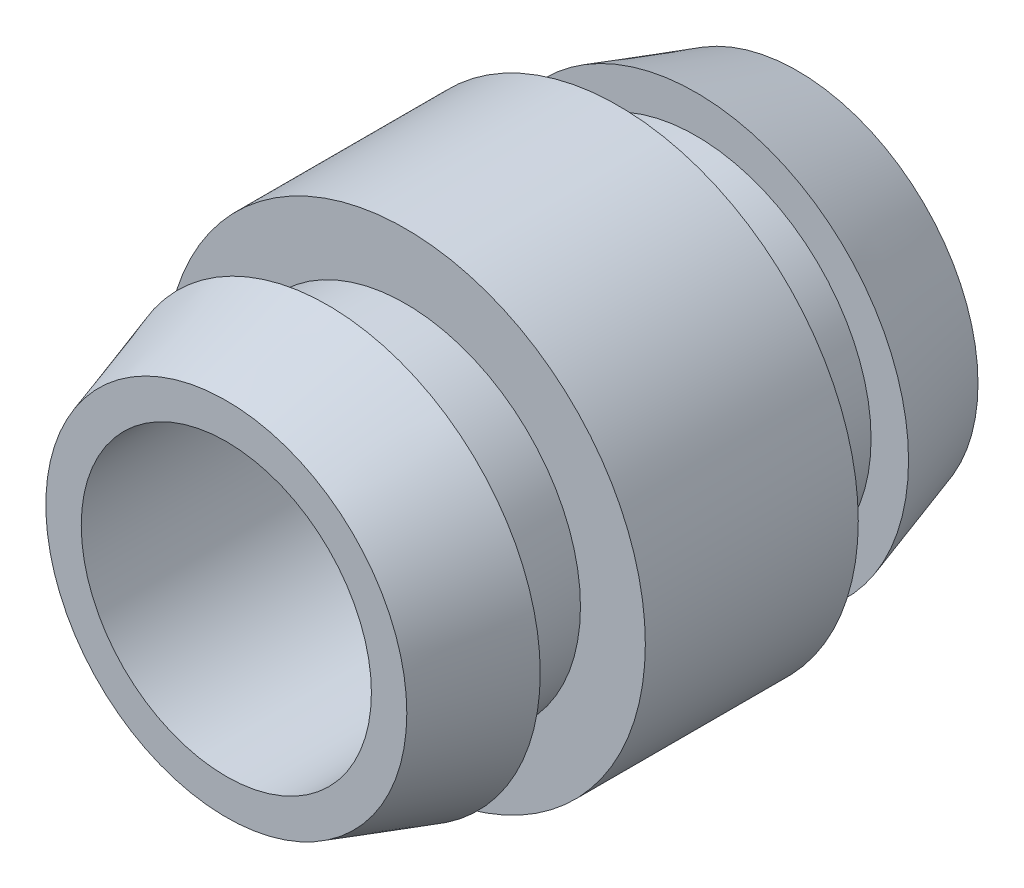
ISO-10303-21;
HEADER;
FILE_DESCRIPTION(('STEP AP214'),'2;1');
FILE_NAME('part.step','',(''),(''),'','','');
FILE_SCHEMA(('AUTOMOTIVE_DESIGN { 1 0 10303 214 1 1 1 1 }'));
ENDSEC;
DATA;
#1=APPLICATION_CONTEXT('core data for automotive mechanical design processes');
#2=APPLICATION_PROTOCOL_DEFINITION('international standard','automotive_design',2000,#1);
#3=PRODUCT_CONTEXT('',#1,'mechanical');
#4=PRODUCT('Part','Part','',(#3));
#5=PRODUCT_RELATED_PRODUCT_CATEGORY('part','',(#4));
#6=PRODUCT_DEFINITION_FORMATION('','',#4);
#7=PRODUCT_DEFINITION_CONTEXT('part definition',#1,'design');
#8=PRODUCT_DEFINITION('design','',#6,#7);
#9=PRODUCT_DEFINITION_SHAPE('','',#8);
#10=(LENGTH_UNIT() NAMED_UNIT(*) SI_UNIT(.MILLI.,.METRE.));
#11=(NAMED_UNIT(*) PLANE_ANGLE_UNIT() SI_UNIT($,.RADIAN.));
#12=(NAMED_UNIT(*) SI_UNIT($,.STERADIAN.) SOLID_ANGLE_UNIT());
#13=UNCERTAINTY_MEASURE_WITH_UNIT(LENGTH_MEASURE(1.E-05),#10,'distance_accuracy_value','');
#14=(GEOMETRIC_REPRESENTATION_CONTEXT(3) GLOBAL_UNCERTAINTY_ASSIGNED_CONTEXT((#13)) GLOBAL_UNIT_ASSIGNED_CONTEXT((#10,
#11,#12)) REPRESENTATION_CONTEXT('',''));
#15=CARTESIAN_POINT('',(0.,0.,0.));
#16=DIRECTION('',(0.,0.,1.));
#17=DIRECTION('',(1.,0.,0.));
#18=AXIS2_PLACEMENT_3D('',#15,#16,#17);
#19=CARTESIAN_POINT('',(0.,-6.0198,-6.85485096527909));
#20=DIRECTION('',(0.,0.,1.));
#21=DIRECTION('',(1.,0.,0.));
#22=AXIS2_PLACEMENT_3D('',#19,#20,#21);
#23=PLANE('',#22);
#24=CARTESIAN_POINT('',(0.,0.,-6.85485096527909));
#25=DIRECTION('',(0.,0.,1.));
#26=DIRECTION('',(1.,0.,0.));
#27=AXIS2_PLACEMENT_3D('',#24,#25,#26);
#28=CIRCLE('',#27,6.0198);
#29=CARTESIAN_POINT('',(6.0198,0.,-6.85485096527909));
#30=VERTEX_POINT('',#29);
#31=EDGE_CURVE('E73',#30,#30,#28,.T.);
#32=ORIENTED_EDGE('',*,*,#31,.T.);
#33=EDGE_LOOP('',(#32));
#34=FACE_BOUND('',#33,.T.);
#35=CARTESIAN_POINT('',(0.,0.,-6.85485096527909));
#36=DIRECTION('',(0.,0.,1.));
#37=DIRECTION('',(1.,0.,0.));
#38=AXIS2_PLACEMENT_3D('',#35,#36,#37);
#39=CIRCLE('',#38,4.8387);
#40=CARTESIAN_POINT('',(4.8387,0.,-6.85485096527909));
#41=VERTEX_POINT('',#40);
#42=EDGE_CURVE('E10',#41,#41,#39,.T.);
#43=ORIENTED_EDGE('',*,*,#42,.F.);
#44=EDGE_LOOP('',(#43));
#45=FACE_BOUND('',#44,.T.);
#46=ADVANCED_FACE('F33',(#34,#45),#23,.T.);
#47=CARTESIAN_POINT('',(0.,0.,-6.85485096527909));
#48=DIRECTION('',(0.,0.,1.));
#49=DIRECTION('',(1.,0.,0.));
#50=AXIS2_PLACEMENT_3D('',#47,#48,#49);
#51=CYLINDRICAL_SURFACE('',#50,4.8387);
#52=ORIENTED_EDGE('',*,*,#42,.T.);
#53=EDGE_LOOP('',(#52));
#54=FACE_BOUND('',#53,.T.);
#55=CARTESIAN_POINT('',(0.,0.,-23.9236509652791));
#56=DIRECTION('',(0.,0.,1.));
#57=DIRECTION('',(1.,0.,0.));
#58=AXIS2_PLACEMENT_3D('',#55,#56,#57);
#59=CIRCLE('',#58,4.8387);
#60=CARTESIAN_POINT('',(4.8387,0.,-23.9236509652791));
#61=VERTEX_POINT('',#60);
#62=EDGE_CURVE('E39',#61,#61,#59,.T.);
#63=ORIENTED_EDGE('',*,*,#62,.F.);
#64=EDGE_LOOP('',(#63));
#65=FACE_BOUND('',#64,.T.);
#66=ADVANCED_FACE('F91',(#54,#65),#51,.F.);
#67=CARTESIAN_POINT('',(0.,-4.8387,-23.9236509652791));
#68=DIRECTION('',(0.,0.,1.));
#69=DIRECTION('',(1.,0.,0.));
#70=AXIS2_PLACEMENT_3D('',#67,#68,#69);
#71=PLANE('',#70);
#72=ORIENTED_EDGE('',*,*,#62,.T.);
#73=EDGE_LOOP('',(#72));
#74=FACE_BOUND('',#73,.T.);
#75=ADVANCED_FACE('F95',(#74),#71,.T.);
#76=CARTESIAN_POINT('',(0.,0.,-25.9048509652791));
#77=DIRECTION('',(0.,0.,-1.));
#78=DIRECTION('',(-1.,0.,0.));
#79=AXIS2_PLACEMENT_3D('',#76,#77,#78);
#80=PLANE('',#79);
#81=CARTESIAN_POINT('',(0.,0.,-25.9048509652791));
#82=DIRECTION('',(0.,0.,1.));
#83=DIRECTION('',(1.,0.,0.));
#84=AXIS2_PLACEMENT_3D('',#81,#82,#83);
#85=CIRCLE('',#84,6.0198);
#86=CARTESIAN_POINT('',(6.0198,0.,-25.9048509652791));
#87=VERTEX_POINT('',#86);
#88=EDGE_CURVE('E43',#87,#87,#85,.T.);
#89=ORIENTED_EDGE('',*,*,#88,.F.);
#90=EDGE_LOOP('',(#89));
#91=FACE_BOUND('',#90,.T.);
#92=ADVANCED_FACE('F99',(#91),#80,.T.);
#93=CARTESIAN_POINT('',(0.,0.,-22.5215709652791));
#94=DIRECTION('',(0.,0.,1.));
#95=DIRECTION('',(1.,0.,0.));
#96=AXIS2_PLACEMENT_3D('',#93,#94,#95);
#97=CONICAL_SURFACE('',#96,7.0866,0.30544765107798);
#98=ORIENTED_EDGE('',*,*,#88,.T.);
#99=EDGE_LOOP('',(#98));
#100=FACE_BOUND('',#99,.T.);
#101=CARTESIAN_POINT('',(0.,0.,-22.5215709652791));
#102=DIRECTION('',(0.,0.,1.));
#103=DIRECTION('',(1.,0.,0.));
#104=AXIS2_PLACEMENT_3D('',#101,#102,#103);
#105=CIRCLE('',#104,7.0866);
#106=CARTESIAN_POINT('',(7.0866,0.,-22.5215709652791));
#107=VERTEX_POINT('',#106);
#108=EDGE_CURVE('E47',#107,#107,#105,.T.);
#109=ORIENTED_EDGE('',*,*,#108,.F.);
#110=EDGE_LOOP('',(#109));
#111=FACE_BOUND('',#110,.T.);
#112=ADVANCED_FACE('F105',(#100,#111),#97,.T.);
#113=CARTESIAN_POINT('',(0.,-7.0866,-22.5215709652791));
#114=DIRECTION('',(0.,0.,1.));
#115=DIRECTION('',(1.,0.,0.));
#116=AXIS2_PLACEMENT_3D('',#113,#114,#115);
#117=PLANE('',#116);
#118=ORIENTED_EDGE('',*,*,#108,.T.);
#119=EDGE_LOOP('',(#118));
#120=FACE_BOUND('',#119,.T.);
#121=CARTESIAN_POINT('',(0.,0.,-22.5215709652791));
#122=DIRECTION('',(0.,0.,1.));
#123=DIRECTION('',(1.,0.,0.));
#124=AXIS2_PLACEMENT_3D('',#121,#122,#123);
#125=CIRCLE('',#124,5.83692);
#126=CARTESIAN_POINT('',(5.83692,0.,-22.5215709652791));
#127=VERTEX_POINT('',#126);
#128=EDGE_CURVE('E52',#127,#127,#125,.T.);
#129=ORIENTED_EDGE('',*,*,#128,.F.);
#130=EDGE_LOOP('',(#129));
#131=FACE_BOUND('',#130,.T.);
#132=ADVANCED_FACE('F109',(#120,#131),#117,.T.);
#133=CARTESIAN_POINT('',(0.,0.,-6.85485096527909));
#134=DIRECTION('',(0.,0.,1.));
#135=DIRECTION('',(1.,0.,0.));
#136=AXIS2_PLACEMENT_3D('',#133,#134,#135);
#137=CYLINDRICAL_SURFACE('',#136,5.83692);
#138=ORIENTED_EDGE('',*,*,#128,.T.);
#139=EDGE_LOOP('',(#138));
#140=FACE_BOUND('',#139,.T.);
#141=CARTESIAN_POINT('',(0.,0.,-19.9307709652791));
#142=DIRECTION('',(0.,0.,1.));
#143=DIRECTION('',(1.,0.,0.));
#144=AXIS2_PLACEMENT_3D('',#141,#142,#143);
#145=CIRCLE('',#144,5.83692);
#146=CARTESIAN_POINT('',(5.83692,0.,-19.9307709652791));
#147=VERTEX_POINT('',#146);
#148=EDGE_CURVE('E55',#147,#147,#145,.T.);
#149=ORIENTED_EDGE('',*,*,#148,.F.);
#150=EDGE_LOOP('',(#149));
#151=FACE_BOUND('',#150,.T.);
#152=ADVANCED_FACE('F113',(#140,#151),#137,.T.);
#153=CARTESIAN_POINT('',(0.,-5.83692,-19.9307709652791));
#154=DIRECTION('',(0.,0.,-1.));
#155=DIRECTION('',(-1.,0.,0.));
#156=AXIS2_PLACEMENT_3D('',#153,#154,#155);
#157=PLANE('',#156);
#158=ORIENTED_EDGE('',*,*,#148,.T.);
#159=EDGE_LOOP('',(#158));
#160=FACE_BOUND('',#159,.T.);
#161=CARTESIAN_POINT('',(0.,0.,-19.9307709652791));
#162=DIRECTION('',(0.,0.,1.));
#163=DIRECTION('',(1.,0.,0.));
#164=AXIS2_PLACEMENT_3D('',#161,#162,#163);
#165=CIRCLE('',#164,8.001);
#166=CARTESIAN_POINT('',(8.001,0.,-19.9307709652791));
#167=VERTEX_POINT('',#166);
#168=EDGE_CURVE('E58',#167,#167,#165,.T.);
#169=ORIENTED_EDGE('',*,*,#168,.F.);
#170=EDGE_LOOP('',(#169));
#171=FACE_BOUND('',#170,.T.);
#172=ADVANCED_FACE('F117',(#160,#171),#157,.T.);
#173=CARTESIAN_POINT('',(0.,0.,-6.85485096527909));
#174=DIRECTION('',(0.,0.,1.));
#175=DIRECTION('',(1.,0.,0.));
#176=AXIS2_PLACEMENT_3D('',#173,#174,#175);
#177=CYLINDRICAL_SURFACE('',#176,8.001);
#178=ORIENTED_EDGE('',*,*,#168,.T.);
#179=EDGE_LOOP('',(#178));
#180=FACE_BOUND('',#179,.T.);
#181=CARTESIAN_POINT('',(0.,0.,-12.8289309652791));
#182=DIRECTION('',(0.,0.,1.));
#183=DIRECTION('',(1.,0.,0.));
#184=AXIS2_PLACEMENT_3D('',#181,#182,#183);
#185=CIRCLE('',#184,8.001);
#186=CARTESIAN_POINT('',(8.001,0.,-12.8289309652791));
#187=VERTEX_POINT('',#186);
#188=EDGE_CURVE('E61',#187,#187,#185,.T.);
#189=ORIENTED_EDGE('',*,*,#188,.F.);
#190=EDGE_LOOP('',(#189));
#191=FACE_BOUND('',#190,.T.);
#192=ADVANCED_FACE('F121',(#180,#191),#177,.T.);
#193=CARTESIAN_POINT('',(0.,-8.001,-12.8289309652791));
#194=DIRECTION('',(0.,0.,1.));
#195=DIRECTION('',(1.,0.,0.));
#196=AXIS2_PLACEMENT_3D('',#193,#194,#195);
#197=PLANE('',#196);
#198=ORIENTED_EDGE('',*,*,#188,.T.);
#199=EDGE_LOOP('',(#198));
#200=FACE_BOUND('',#199,.T.);
#201=CARTESIAN_POINT('',(0.,0.,-12.8289309652791));
#202=DIRECTION('',(0.,0.,1.));
#203=DIRECTION('',(1.,0.,0.));
#204=AXIS2_PLACEMENT_3D('',#201,#202,#203);
#205=CIRCLE('',#204,5.83692);
#206=CARTESIAN_POINT('',(5.83692,0.,-12.8289309652791));
#207=VERTEX_POINT('',#206);
#208=EDGE_CURVE('E64',#207,#207,#205,.T.);
#209=ORIENTED_EDGE('',*,*,#208,.F.);
#210=EDGE_LOOP('',(#209));
#211=FACE_BOUND('',#210,.T.);
#212=ADVANCED_FACE('F125',(#200,#211),#197,.T.);
#213=CARTESIAN_POINT('',(0.,0.,-6.85485096527909));
#214=DIRECTION('',(0.,0.,1.));
#215=DIRECTION('',(1.,0.,0.));
#216=AXIS2_PLACEMENT_3D('',#213,#214,#215);
#217=CYLINDRICAL_SURFACE('',#216,5.83692);
#218=ORIENTED_EDGE('',*,*,#208,.T.);
#219=EDGE_LOOP('',(#218));
#220=FACE_BOUND('',#219,.T.);
#221=CARTESIAN_POINT('',(0.,0.,-10.2381309652791));
#222=DIRECTION('',(0.,0.,1.));
#223=DIRECTION('',(1.,0.,0.));
#224=AXIS2_PLACEMENT_3D('',#221,#222,#223);
#225=CIRCLE('',#224,5.83692);
#226=CARTESIAN_POINT('',(5.83692,0.,-10.2381309652791));
#227=VERTEX_POINT('',#226);
#228=EDGE_CURVE('E67',#227,#227,#225,.T.);
#229=ORIENTED_EDGE('',*,*,#228,.F.);
#230=EDGE_LOOP('',(#229));
#231=FACE_BOUND('',#230,.T.);
#232=ADVANCED_FACE('F87',(#220,#231),#217,.T.);
#233=CARTESIAN_POINT('',(0.,-5.83692,-10.2381309652791));
#234=DIRECTION('',(0.,0.,-1.));
#235=DIRECTION('',(-1.,0.,0.));
#236=AXIS2_PLACEMENT_3D('',#233,#234,#235);
#237=PLANE('',#236);
#238=ORIENTED_EDGE('',*,*,#228,.T.);
#239=EDGE_LOOP('',(#238));
#240=FACE_BOUND('',#239,.T.);
#241=CARTESIAN_POINT('',(0.,0.,-10.2381309652791));
#242=DIRECTION('',(0.,0.,1.));
#243=DIRECTION('',(1.,0.,0.));
#244=AXIS2_PLACEMENT_3D('',#241,#242,#243);
#245=CIRCLE('',#244,7.0866);
#246=CARTESIAN_POINT('',(7.0866,0.,-10.2381309652791));
#247=VERTEX_POINT('',#246);
#248=EDGE_CURVE('E70',#247,#247,#245,.T.);
#249=ORIENTED_EDGE('',*,*,#248,.F.);
#250=EDGE_LOOP('',(#249));
#251=FACE_BOUND('',#250,.T.);
#252=ADVANCED_FACE('F81',(#240,#251),#237,.T.);
#253=CARTESIAN_POINT('',(0.,0.,-6.85485096527909));
#254=DIRECTION('',(0.,0.,-1.));
#255=DIRECTION('',(-1.,0.,0.));
#256=AXIS2_PLACEMENT_3D('',#253,#254,#255);
#257=CONICAL_SURFACE('',#256,6.0198,0.30544765107798);
#258=ORIENTED_EDGE('',*,*,#248,.T.);
#259=EDGE_LOOP('',(#258));
#260=FACE_BOUND('',#259,.T.);
#261=ORIENTED_EDGE('',*,*,#31,.F.);
#262=EDGE_LOOP('',(#261));
#263=FACE_BOUND('',#262,.T.);
#264=ADVANCED_FACE('F79',(#260,#263),#257,.T.);
#265=CLOSED_SHELL('',(#46,#66,#75,#92,#112,#132,#152,#172,#192,#212,#232,#252,#264));
#266=MANIFOLD_SOLID_BREP('B2',#265);
#267=ADVANCED_BREP_SHAPE_REPRESENTATION('',(#18,#266),#14);
#268=SHAPE_DEFINITION_REPRESENTATION(#9,#267);
ENDSEC;
END-ISO-10303-21;
